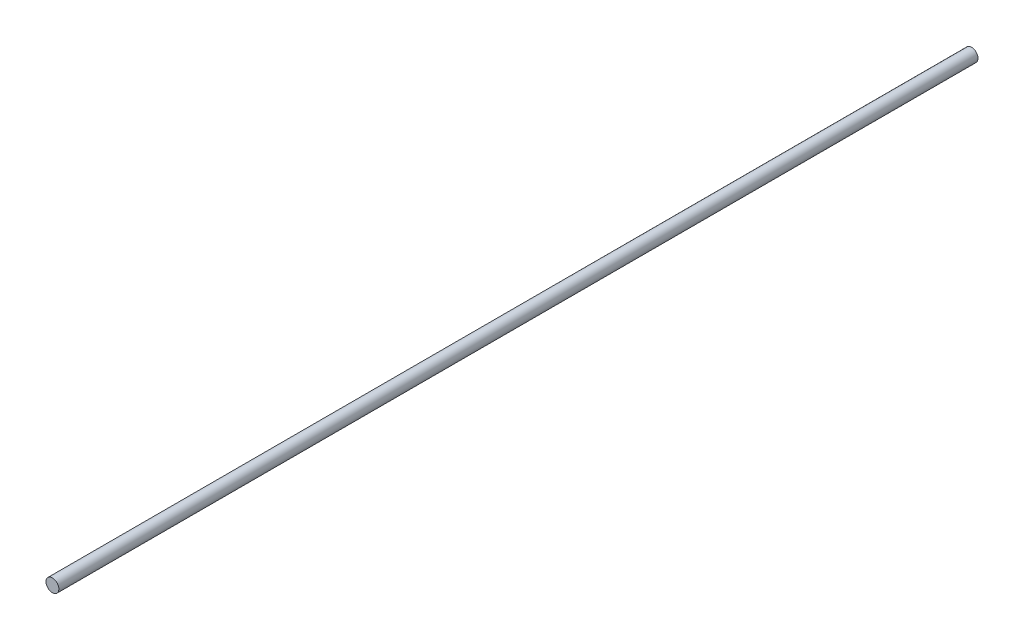
ISO-10303-21;
HEADER;
FILE_DESCRIPTION(('STEP AP214'),'2;1');
FILE_NAME('part.step','',(''),(''),'','','');
FILE_SCHEMA(('AUTOMOTIVE_DESIGN { 1 0 10303 214 1 1 1 1 }'));
ENDSEC;
DATA;
#1=APPLICATION_CONTEXT('core data for automotive mechanical design processes');
#2=APPLICATION_PROTOCOL_DEFINITION('international standard','automotive_design',2000,#1);
#3=PRODUCT_CONTEXT('',#1,'mechanical');
#4=PRODUCT('Part','Part','',(#3));
#5=PRODUCT_RELATED_PRODUCT_CATEGORY('part','',(#4));
#6=PRODUCT_DEFINITION_FORMATION('','',#4);
#7=PRODUCT_DEFINITION_CONTEXT('part definition',#1,'design');
#8=PRODUCT_DEFINITION('design','',#6,#7);
#9=PRODUCT_DEFINITION_SHAPE('','',#8);
#10=(LENGTH_UNIT() NAMED_UNIT(*) SI_UNIT(.MILLI.,.METRE.));
#11=(NAMED_UNIT(*) PLANE_ANGLE_UNIT() SI_UNIT($,.RADIAN.));
#12=(NAMED_UNIT(*) SI_UNIT($,.STERADIAN.) SOLID_ANGLE_UNIT());
#13=UNCERTAINTY_MEASURE_WITH_UNIT(LENGTH_MEASURE(1.E-05),#10,'distance_accuracy_value','');
#14=(GEOMETRIC_REPRESENTATION_CONTEXT(3) GLOBAL_UNCERTAINTY_ASSIGNED_CONTEXT((#13)) GLOBAL_UNIT_ASSIGNED_CONTEXT((#10,
#11,#12)) REPRESENTATION_CONTEXT('',''));
#15=CARTESIAN_POINT('',(0.,0.,0.));
#16=DIRECTION('',(0.,0.,1.));
#17=DIRECTION('',(1.,0.,0.));
#18=AXIS2_PLACEMENT_3D('',#15,#16,#17);
#19=CARTESIAN_POINT('',(0.,0.,500.));
#20=DIRECTION('',(0.,0.,-1.));
#21=DIRECTION('',(-1.,0.,0.));
#22=AXIS2_PLACEMENT_3D('',#19,#20,#21);
#23=CYLINDRICAL_SURFACE('',#22,3.5);
#24=CARTESIAN_POINT('',(0.,0.,500.));
#25=DIRECTION('',(0.,0.,1.));
#26=DIRECTION('',(1.,0.,0.));
#27=AXIS2_PLACEMENT_3D('',#24,#25,#26);
#28=CIRCLE('',#27,3.5);
#29=CARTESIAN_POINT('',(3.5,0.,500.));
#30=VERTEX_POINT('',#29);
#31=EDGE_CURVE('E10',#30,#30,#28,.T.);
#32=ORIENTED_EDGE('',*,*,#31,.F.);
#33=EDGE_LOOP('',(#32));
#34=FACE_BOUND('',#33,.T.);
#35=CARTESIAN_POINT('',(0.,0.,0.));
#36=DIRECTION('',(0.,0.,1.));
#37=DIRECTION('',(1.,0.,0.));
#38=AXIS2_PLACEMENT_3D('',#35,#36,#37);
#39=CIRCLE('',#38,3.5);
#40=CARTESIAN_POINT('',(3.5,0.,0.));
#41=VERTEX_POINT('',#40);
#42=EDGE_CURVE('E40',#41,#41,#39,.T.);
#43=ORIENTED_EDGE('',*,*,#42,.T.);
#44=EDGE_LOOP('',(#43));
#45=FACE_BOUND('',#44,.T.);
#46=ADVANCED_FACE('F37',(#34,#45),#23,.T.);
#47=CARTESIAN_POINT('',(0.,0.,500.));
#48=DIRECTION('',(0.,0.,1.));
#49=DIRECTION('',(1.,0.,0.));
#50=AXIS2_PLACEMENT_3D('',#47,#48,#49);
#51=PLANE('',#50);
#52=ORIENTED_EDGE('',*,*,#31,.T.);
#53=EDGE_LOOP('',(#52));
#54=FACE_BOUND('',#53,.T.);
#55=ADVANCED_FACE('F54',(#54),#51,.T.);
#56=CARTESIAN_POINT('',(0.,0.,0.));
#57=DIRECTION('',(0.,0.,1.));
#58=DIRECTION('',(1.,0.,0.));
#59=AXIS2_PLACEMENT_3D('',#56,#57,#58);
#60=PLANE('',#59);
#61=ORIENTED_EDGE('',*,*,#42,.F.);
#62=EDGE_LOOP('',(#61));
#63=FACE_BOUND('',#62,.T.);
#64=ADVANCED_FACE('F52',(#63),#60,.F.);
#65=CLOSED_SHELL('',(#46,#55,#64));
#66=MANIFOLD_SOLID_BREP('B2',#65);
#67=ADVANCED_BREP_SHAPE_REPRESENTATION('',(#18,#66),#14);
#68=SHAPE_DEFINITION_REPRESENTATION(#9,#67);
ENDSEC;
END-ISO-10303-21;
